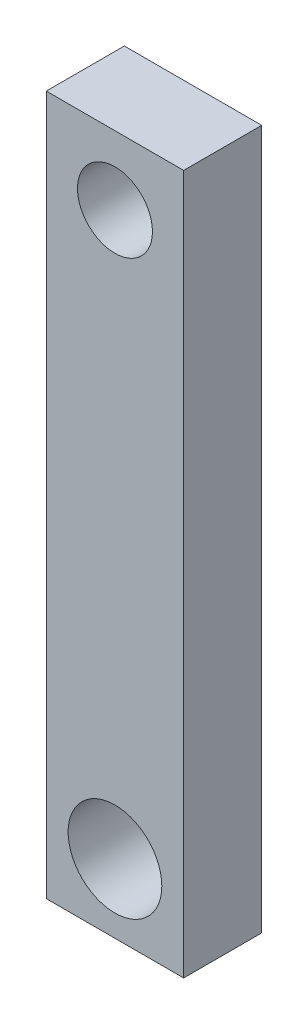
ISO-10303-21;
HEADER;
FILE_DESCRIPTION(('STEP AP214'),'2;1');
FILE_NAME('part.step','',(''),(''),'','','');
FILE_SCHEMA(('AUTOMOTIVE_DESIGN { 1 0 10303 214 1 1 1 1 }'));
ENDSEC;
DATA;
#1=APPLICATION_CONTEXT('core data for automotive mechanical design processes');
#2=APPLICATION_PROTOCOL_DEFINITION('international standard','automotive_design',2000,#1);
#3=PRODUCT_CONTEXT('',#1,'mechanical');
#4=PRODUCT('Part','Part','',(#3));
#5=PRODUCT_RELATED_PRODUCT_CATEGORY('part','',(#4));
#6=PRODUCT_DEFINITION_FORMATION('','',#4);
#7=PRODUCT_DEFINITION_CONTEXT('part definition',#1,'design');
#8=PRODUCT_DEFINITION('design','',#6,#7);
#9=PRODUCT_DEFINITION_SHAPE('','',#8);
#10=(LENGTH_UNIT() NAMED_UNIT(*) SI_UNIT(.MILLI.,.METRE.));
#11=(NAMED_UNIT(*) PLANE_ANGLE_UNIT() SI_UNIT($,.RADIAN.));
#12=(NAMED_UNIT(*) SI_UNIT($,.STERADIAN.) SOLID_ANGLE_UNIT());
#13=UNCERTAINTY_MEASURE_WITH_UNIT(LENGTH_MEASURE(1.E-05),#10,'distance_accuracy_value','');
#14=(GEOMETRIC_REPRESENTATION_CONTEXT(3) GLOBAL_UNCERTAINTY_ASSIGNED_CONTEXT((#13)) GLOBAL_UNIT_ASSIGNED_CONTEXT((#10,
#11,#12)) REPRESENTATION_CONTEXT('',''));
#15=CARTESIAN_POINT('',(0.,0.,0.));
#16=DIRECTION('',(0.,0.,1.));
#17=DIRECTION('',(1.,0.,0.));
#18=AXIS2_PLACEMENT_3D('',#15,#16,#17);
#19=CARTESIAN_POINT('',(0.,0.,25.));
#20=DIRECTION('',(0.,0.,-1.));
#21=DIRECTION('',(-1.,0.,0.));
#22=AXIS2_PLACEMENT_3D('',#19,#20,#21);
#23=PLANE('',#22);
#24=DIRECTION('',(0.,-1.,0.));
#25=VECTOR('',#24,1.);
#26=CARTESIAN_POINT('',(-22.,-22.,25.));
#27=LINE('',#26,#25);
#28=CARTESIAN_POINT('',(-22.,202.,25.));
#29=VERTEX_POINT('',#28);
#30=CARTESIAN_POINT('',(-22.,-22.,25.));
#31=VERTEX_POINT('',#30);
#32=EDGE_CURVE('E91',#29,#31,#27,.T.);
#33=ORIENTED_EDGE('',*,*,#32,.T.);
#34=DIRECTION('',(1.,0.,0.));
#35=VECTOR('',#34,1.);
#36=CARTESIAN_POINT('',(-22.,-22.,25.));
#37=LINE('',#36,#35);
#38=CARTESIAN_POINT('',(22.,-22.,25.));
#39=VERTEX_POINT('',#38);
#40=EDGE_CURVE('E86',#31,#39,#37,.T.);
#41=ORIENTED_EDGE('',*,*,#40,.T.);
#42=DIRECTION('',(0.,1.,0.));
#43=VECTOR('',#42,1.);
#44=CARTESIAN_POINT('',(22.,-22.,25.));
#45=LINE('',#44,#43);
#46=CARTESIAN_POINT('',(22.,202.,25.));
#47=VERTEX_POINT('',#46);
#48=EDGE_CURVE('E87',#39,#47,#45,.T.);
#49=ORIENTED_EDGE('',*,*,#48,.T.);
#50=DIRECTION('',(-1.,0.,0.));
#51=VECTOR('',#50,1.);
#52=CARTESIAN_POINT('',(-22.,202.,25.));
#53=LINE('',#52,#51);
#54=EDGE_CURVE('E57',#47,#29,#53,.T.);
#55=ORIENTED_EDGE('',*,*,#54,.T.);
#56=EDGE_LOOP('',(#33,#41,#49,#55));
#57=FACE_BOUND('',#56,.T.);
#58=CARTESIAN_POINT('',(0.,0.,25.));
#59=DIRECTION('',(0.,0.,1.));
#60=DIRECTION('',(1.,0.,0.));
#61=AXIS2_PLACEMENT_3D('',#58,#59,#60);
#62=CIRCLE('',#61,15.);
#63=CARTESIAN_POINT('',(15.,0.,25.));
#64=VERTEX_POINT('',#63);
#65=EDGE_CURVE('E106',#64,#64,#62,.T.);
#66=ORIENTED_EDGE('',*,*,#65,.F.);
#67=EDGE_LOOP('',(#66));
#68=FACE_BOUND('',#67,.T.);
#69=CARTESIAN_POINT('',(0.,180.,25.));
#70=DIRECTION('',(0.,0.,1.));
#71=DIRECTION('',(1.,0.,0.));
#72=AXIS2_PLACEMENT_3D('',#69,#70,#71);
#73=CIRCLE('',#72,12.);
#74=CARTESIAN_POINT('',(12.,180.,25.));
#75=VERTEX_POINT('',#74);
#76=EDGE_CURVE('E123',#75,#75,#73,.T.);
#77=ORIENTED_EDGE('',*,*,#76,.F.);
#78=EDGE_LOOP('',(#77));
#79=FACE_BOUND('',#78,.T.);
#80=ADVANCED_FACE('F39',(#57,#68,#79),#23,.F.);
#81=CARTESIAN_POINT('',(0.,0.,0.));
#82=DIRECTION('',(0.,0.,-1.));
#83=DIRECTION('',(-1.,0.,0.));
#84=AXIS2_PLACEMENT_3D('',#81,#82,#83);
#85=PLANE('',#84);
#86=CARTESIAN_POINT('',(0.,0.,0.));
#87=DIRECTION('',(0.,0.,1.));
#88=DIRECTION('',(1.,0.,0.));
#89=AXIS2_PLACEMENT_3D('',#86,#87,#88);
#90=CIRCLE('',#89,15.);
#91=CARTESIAN_POINT('',(15.,0.,0.));
#92=VERTEX_POINT('',#91);
#93=EDGE_CURVE('E119',#92,#92,#90,.T.);
#94=ORIENTED_EDGE('',*,*,#93,.T.);
#95=EDGE_LOOP('',(#94));
#96=FACE_BOUND('',#95,.T.);
#97=DIRECTION('',(0.,-1.,0.));
#98=VECTOR('',#97,1.);
#99=CARTESIAN_POINT('',(-22.,-22.,0.));
#100=LINE('',#99,#98);
#101=CARTESIAN_POINT('',(-22.,202.,0.));
#102=VERTEX_POINT('',#101);
#103=CARTESIAN_POINT('',(-22.,-22.,0.));
#104=VERTEX_POINT('',#103);
#105=EDGE_CURVE('E104',#102,#104,#100,.T.);
#106=ORIENTED_EDGE('',*,*,#105,.F.);
#107=DIRECTION('',(-1.,0.,0.));
#108=VECTOR('',#107,1.);
#109=CARTESIAN_POINT('',(-22.,202.,0.));
#110=LINE('',#109,#108);
#111=CARTESIAN_POINT('',(22.,202.,0.));
#112=VERTEX_POINT('',#111);
#113=EDGE_CURVE('E80',#112,#102,#110,.T.);
#114=ORIENTED_EDGE('',*,*,#113,.F.);
#115=DIRECTION('',(0.,1.,0.));
#116=VECTOR('',#115,1.);
#117=CARTESIAN_POINT('',(22.,-22.,0.));
#118=LINE('',#117,#116);
#119=CARTESIAN_POINT('',(22.,-22.,0.));
#120=VERTEX_POINT('',#119);
#121=EDGE_CURVE('E74',#120,#112,#118,.T.);
#122=ORIENTED_EDGE('',*,*,#121,.F.);
#123=DIRECTION('',(1.,0.,0.));
#124=VECTOR('',#123,1.);
#125=CARTESIAN_POINT('',(-22.,-22.,0.));
#126=LINE('',#125,#124);
#127=EDGE_CURVE('E94',#104,#120,#126,.T.);
#128=ORIENTED_EDGE('',*,*,#127,.F.);
#129=EDGE_LOOP('',(#106,#114,#122,#128));
#130=FACE_BOUND('',#129,.T.);
#131=CARTESIAN_POINT('',(0.,180.,0.));
#132=DIRECTION('',(0.,0.,1.));
#133=DIRECTION('',(1.,0.,0.));
#134=AXIS2_PLACEMENT_3D('',#131,#132,#133);
#135=CIRCLE('',#134,12.);
#136=CARTESIAN_POINT('',(12.,180.,0.));
#137=VERTEX_POINT('',#136);
#138=EDGE_CURVE('E125',#137,#137,#135,.T.);
#139=ORIENTED_EDGE('',*,*,#138,.T.);
#140=EDGE_LOOP('',(#139));
#141=FACE_BOUND('',#140,.T.);
#142=ADVANCED_FACE('F114',(#96,#130,#141),#85,.T.);
#143=CARTESIAN_POINT('',(-22.,-22.,25.));
#144=DIRECTION('',(1.,0.,0.));
#145=DIRECTION('',(0.,0.,-1.));
#146=AXIS2_PLACEMENT_3D('',#143,#144,#145);
#147=PLANE('',#146);
#148=ORIENTED_EDGE('',*,*,#105,.T.);
#149=DIRECTION('',(0.,0.,-1.));
#150=VECTOR('',#149,1.);
#151=CARTESIAN_POINT('',(-22.,-22.,25.));
#152=LINE('',#151,#150);
#153=EDGE_CURVE('E11',#31,#104,#152,.T.);
#154=ORIENTED_EDGE('',*,*,#153,.F.);
#155=ORIENTED_EDGE('',*,*,#32,.F.);
#156=DIRECTION('',(0.,0.,-1.));
#157=VECTOR('',#156,1.);
#158=CARTESIAN_POINT('',(-22.,202.,25.));
#159=LINE('',#158,#157);
#160=EDGE_CURVE('E98',#29,#102,#159,.T.);
#161=ORIENTED_EDGE('',*,*,#160,.T.);
#162=EDGE_LOOP('',(#148,#154,#155,#161));
#163=FACE_BOUND('',#162,.T.);
#164=ADVANCED_FACE('F41',(#163),#147,.F.);
#165=CARTESIAN_POINT('',(-22.,-22.,25.));
#166=DIRECTION('',(0.,1.,0.));
#167=DIRECTION('',(0.,0.,1.));
#168=AXIS2_PLACEMENT_3D('',#165,#166,#167);
#169=PLANE('',#168);
#170=ORIENTED_EDGE('',*,*,#127,.T.);
#171=DIRECTION('',(0.,0.,-1.));
#172=VECTOR('',#171,1.);
#173=CARTESIAN_POINT('',(22.,-22.,25.));
#174=LINE('',#173,#172);
#175=EDGE_CURVE('E48',#39,#120,#174,.T.);
#176=ORIENTED_EDGE('',*,*,#175,.F.);
#177=ORIENTED_EDGE('',*,*,#40,.F.);
#178=ORIENTED_EDGE('',*,*,#153,.T.);
#179=EDGE_LOOP('',(#170,#176,#177,#178));
#180=FACE_BOUND('',#179,.T.);
#181=ADVANCED_FACE('F92',(#180),#169,.F.);
#182=CARTESIAN_POINT('',(22.,-22.,25.));
#183=DIRECTION('',(-1.,0.,0.));
#184=DIRECTION('',(0.,0.,1.));
#185=AXIS2_PLACEMENT_3D('',#182,#183,#184);
#186=PLANE('',#185);
#187=ORIENTED_EDGE('',*,*,#121,.T.);
#188=DIRECTION('',(0.,0.,-1.));
#189=VECTOR('',#188,1.);
#190=CARTESIAN_POINT('',(22.,202.,25.));
#191=LINE('',#190,#189);
#192=EDGE_CURVE('E96',#47,#112,#191,.T.);
#193=ORIENTED_EDGE('',*,*,#192,.F.);
#194=ORIENTED_EDGE('',*,*,#48,.F.);
#195=ORIENTED_EDGE('',*,*,#175,.T.);
#196=EDGE_LOOP('',(#187,#193,#194,#195));
#197=FACE_BOUND('',#196,.T.);
#198=ADVANCED_FACE('F100',(#197),#186,.F.);
#199=CARTESIAN_POINT('',(-22.,202.,25.));
#200=DIRECTION('',(0.,-1.,0.));
#201=DIRECTION('',(0.,0.,-1.));
#202=AXIS2_PLACEMENT_3D('',#199,#200,#201);
#203=PLANE('',#202);
#204=ORIENTED_EDGE('',*,*,#113,.T.);
#205=ORIENTED_EDGE('',*,*,#160,.F.);
#206=ORIENTED_EDGE('',*,*,#54,.F.);
#207=ORIENTED_EDGE('',*,*,#192,.T.);
#208=EDGE_LOOP('',(#204,#205,#206,#207));
#209=FACE_BOUND('',#208,.T.);
#210=ADVANCED_FACE('F112',(#209),#203,.F.);
#211=CARTESIAN_POINT('',(0.,0.,25.));
#212=DIRECTION('',(0.,0.,-1.));
#213=DIRECTION('',(-1.,0.,0.));
#214=AXIS2_PLACEMENT_3D('',#211,#212,#213);
#215=CYLINDRICAL_SURFACE('',#214,15.);
#216=ORIENTED_EDGE('',*,*,#65,.T.);
#217=EDGE_LOOP('',(#216));
#218=FACE_BOUND('',#217,.T.);
#219=ORIENTED_EDGE('',*,*,#93,.F.);
#220=EDGE_LOOP('',(#219));
#221=FACE_BOUND('',#220,.T.);
#222=ADVANCED_FACE('F141',(#218,#221),#215,.F.);
#223=CARTESIAN_POINT('',(0.,180.,25.));
#224=DIRECTION('',(0.,0.,-1.));
#225=DIRECTION('',(-1.,0.,0.));
#226=AXIS2_PLACEMENT_3D('',#223,#224,#225);
#227=CYLINDRICAL_SURFACE('',#226,12.);
#228=ORIENTED_EDGE('',*,*,#76,.T.);
#229=EDGE_LOOP('',(#228));
#230=FACE_BOUND('',#229,.T.);
#231=ORIENTED_EDGE('',*,*,#138,.F.);
#232=EDGE_LOOP('',(#231));
#233=FACE_BOUND('',#232,.T.);
#234=ADVANCED_FACE('F127',(#230,#233),#227,.F.);
#235=CLOSED_SHELL('',(#80,#142,#164,#181,#198,#210,#222,#234));
#236=MANIFOLD_SOLID_BREP('B2',#235);
#237=ADVANCED_BREP_SHAPE_REPRESENTATION('',(#18,#236),#14);
#238=SHAPE_DEFINITION_REPRESENTATION(#9,#237);
ENDSEC;
END-ISO-10303-21;
